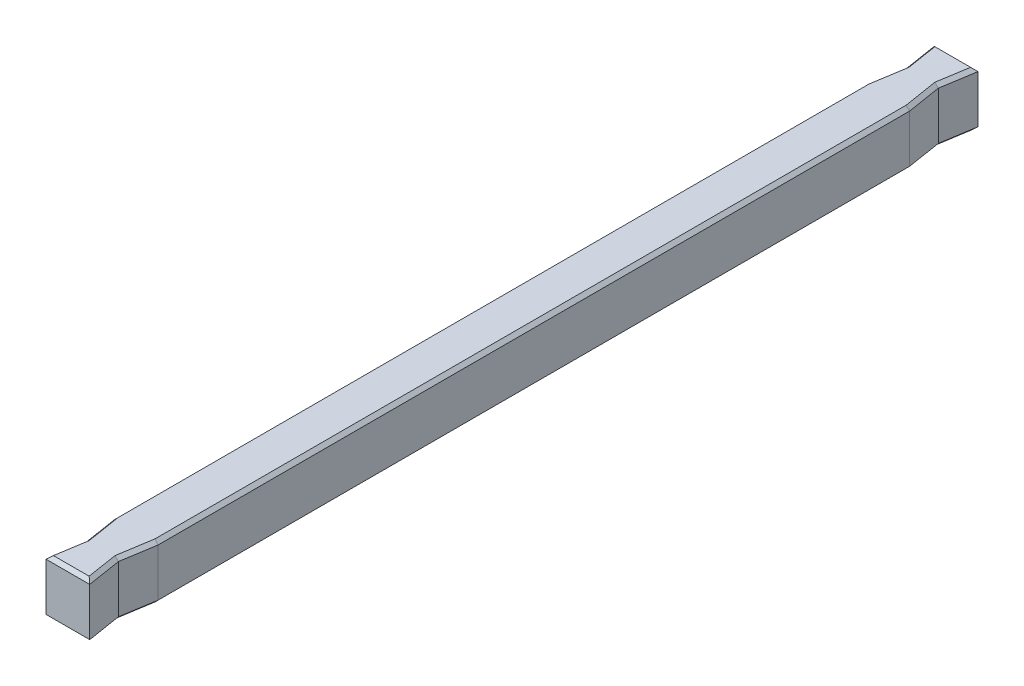
ISO-10303-21;
HEADER;
FILE_DESCRIPTION(('STEP AP214'),'2;1');
FILE_NAME('part.step','',(''),(''),'','','');
FILE_SCHEMA(('AUTOMOTIVE_DESIGN { 1 0 10303 214 1 1 1 1 }'));
ENDSEC;
DATA;
#1=APPLICATION_CONTEXT('core data for automotive mechanical design processes');
#2=APPLICATION_PROTOCOL_DEFINITION('international standard','automotive_design',2000,#1);
#3=PRODUCT_CONTEXT('',#1,'mechanical');
#4=PRODUCT('Part','Part','',(#3));
#5=PRODUCT_RELATED_PRODUCT_CATEGORY('part','',(#4));
#6=PRODUCT_DEFINITION_FORMATION('','',#4);
#7=PRODUCT_DEFINITION_CONTEXT('part definition',#1,'design');
#8=PRODUCT_DEFINITION('design','',#6,#7);
#9=PRODUCT_DEFINITION_SHAPE('','',#8);
#10=(LENGTH_UNIT() NAMED_UNIT(*) SI_UNIT(.MILLI.,.METRE.));
#11=(NAMED_UNIT(*) PLANE_ANGLE_UNIT() SI_UNIT($,.RADIAN.));
#12=(NAMED_UNIT(*) SI_UNIT($,.STERADIAN.) SOLID_ANGLE_UNIT());
#13=UNCERTAINTY_MEASURE_WITH_UNIT(LENGTH_MEASURE(1.E-05),#10,'distance_accuracy_value','');
#14=(GEOMETRIC_REPRESENTATION_CONTEXT(3) GLOBAL_UNCERTAINTY_ASSIGNED_CONTEXT((#13)) GLOBAL_UNIT_ASSIGNED_CONTEXT((#10,
#11,#12)) REPRESENTATION_CONTEXT('',''));
#15=CARTESIAN_POINT('',(0.,0.,0.));
#16=DIRECTION('',(0.,0.,1.));
#17=DIRECTION('',(1.,0.,0.));
#18=AXIS2_PLACEMENT_3D('',#15,#16,#17);
#19=CARTESIAN_POINT('',(-1.6,4.,0.));
#20=DIRECTION('',(0.987440631916705,0.,0.157990501106673));
#21=DIRECTION('',(0.157990501106673,0.,-0.987440631916705));
#22=AXIS2_PLACEMENT_3D('',#19,#20,#21);
#23=PLANE('',#22);
#24=DIRECTION('',(0.,-1.,0.));
#25=VECTOR('',#24,1.);
#26=CARTESIAN_POINT('',(-1.2,4.,-2.5));
#27=LINE('',#26,#25);
#28=CARTESIAN_POINT('',(-1.2,3.74999999999999,-2.5));
#29=VERTEX_POINT('',#28);
#30=CARTESIAN_POINT('',(-1.2,0.249999999999986,-2.5));
#31=VERTEX_POINT('',#30);
#32=EDGE_CURVE('E364',#29,#31,#27,.T.);
#33=ORIENTED_EDGE('',*,*,#32,.T.);
#34=DIRECTION('',(-0.157990501106673,0.,0.987440631916705));
#35=VECTOR('',#34,1.);
#36=CARTESIAN_POINT('',(-1.6,0.249999999999986,0.));
#37=LINE('',#36,#35);
#38=CARTESIAN_POINT('',(-1.6,0.249999999999986,0.));
#39=VERTEX_POINT('',#38);
#40=EDGE_CURVE('E309',#31,#39,#37,.T.);
#41=ORIENTED_EDGE('',*,*,#40,.T.);
#42=DIRECTION('',(0.,-1.,0.));
#43=VECTOR('',#42,1.);
#44=CARTESIAN_POINT('',(-1.6,4.,0.));
#45=LINE('',#44,#43);
#46=CARTESIAN_POINT('',(-1.6,3.74999999999999,0.));
#47=VERTEX_POINT('',#46);
#48=EDGE_CURVE('E224',#47,#39,#45,.T.);
#49=ORIENTED_EDGE('',*,*,#48,.F.);
#50=DIRECTION('',(0.157990501106673,0.,-0.987440631916705));
#51=VECTOR('',#50,1.);
#52=CARTESIAN_POINT('',(-1.6,3.74999999999999,0.));
#53=LINE('',#52,#51);
#54=EDGE_CURVE('E307',#47,#29,#53,.T.);
#55=ORIENTED_EDGE('',*,*,#54,.T.);
#56=EDGE_LOOP('',(#33,#41,#49,#55));
#57=FACE_BOUND('',#56,.T.);
#58=ADVANCED_FACE('F39',(#57),#23,.F.);
#59=CARTESIAN_POINT('',(-1.6,4.,0.));
#60=DIRECTION('',(0.,0.,-1.));
#61=DIRECTION('',(-1.,0.,0.));
#62=AXIS2_PLACEMENT_3D('',#59,#60,#61);
#63=PLANE('',#62);
#64=ORIENTED_EDGE('',*,*,#48,.T.);
#65=DIRECTION('',(1.,0.,0.));
#66=VECTOR('',#65,1.);
#67=CARTESIAN_POINT('',(1.6,0.249999999999986,0.));
#68=LINE('',#67,#66);
#69=CARTESIAN_POINT('',(1.6,0.249999999999986,0.));
#70=VERTEX_POINT('',#69);
#71=EDGE_CURVE('E223',#39,#70,#68,.T.);
#72=ORIENTED_EDGE('',*,*,#71,.T.);
#73=DIRECTION('',(0.,-1.,0.));
#74=VECTOR('',#73,1.);
#75=CARTESIAN_POINT('',(1.6,4.,0.));
#76=LINE('',#75,#74);
#77=CARTESIAN_POINT('',(1.6,3.74999999999999,0.));
#78=VERTEX_POINT('',#77);
#79=EDGE_CURVE('E205',#78,#70,#76,.T.);
#80=ORIENTED_EDGE('',*,*,#79,.F.);
#81=DIRECTION('',(-1.,0.,0.));
#82=VECTOR('',#81,1.);
#83=CARTESIAN_POINT('',(-1.6,3.74999999999999,0.));
#84=LINE('',#83,#82);
#85=EDGE_CURVE('E220',#78,#47,#84,.T.);
#86=ORIENTED_EDGE('',*,*,#85,.T.);
#87=EDGE_LOOP('',(#64,#72,#80,#86));
#88=FACE_BOUND('',#87,.T.);
#89=ADVANCED_FACE('F218',(#88),#63,.F.);
#90=CARTESIAN_POINT('',(1.2,4.,-2.5));
#91=DIRECTION('',(-0.987440631916705,0.,0.157990501106673));
#92=DIRECTION('',(0.157990501106673,0.,0.987440631916705));
#93=AXIS2_PLACEMENT_3D('',#90,#91,#92);
#94=PLANE('',#93);
#95=ORIENTED_EDGE('',*,*,#79,.T.);
#96=DIRECTION('',(-0.157990501106673,0.,-0.987440631916705));
#97=VECTOR('',#96,1.);
#98=CARTESIAN_POINT('',(1.2,0.249999999999986,-2.5));
#99=LINE('',#98,#97);
#100=CARTESIAN_POINT('',(1.2,0.249999999999986,-2.5));
#101=VERTEX_POINT('',#100);
#102=EDGE_CURVE('E212',#70,#101,#99,.T.);
#103=ORIENTED_EDGE('',*,*,#102,.T.);
#104=DIRECTION('',(0.,-1.,0.));
#105=VECTOR('',#104,1.);
#106=CARTESIAN_POINT('',(1.2,4.,-2.5));
#107=LINE('',#106,#105);
#108=CARTESIAN_POINT('',(1.2,3.74999999999999,-2.5));
#109=VERTEX_POINT('',#108);
#110=EDGE_CURVE('E207',#109,#101,#107,.T.);
#111=ORIENTED_EDGE('',*,*,#110,.F.);
#112=DIRECTION('',(0.157990501106673,0.,0.987440631916705));
#113=VECTOR('',#112,1.);
#114=CARTESIAN_POINT('',(1.2,3.74999999999999,-2.5));
#115=LINE('',#114,#113);
#116=EDGE_CURVE('E202',#109,#78,#115,.T.);
#117=ORIENTED_EDGE('',*,*,#116,.T.);
#118=EDGE_LOOP('',(#95,#103,#111,#117));
#119=FACE_BOUND('',#118,.T.);
#120=ADVANCED_FACE('F204',(#119),#94,.F.);
#121=CARTESIAN_POINT('',(1.6,4.,-5.));
#122=DIRECTION('',(-0.987440631916705,0.,-0.157990501106673));
#123=DIRECTION('',(-0.157990501106673,0.,0.987440631916705));
#124=AXIS2_PLACEMENT_3D('',#121,#122,#123);
#125=PLANE('',#124);
#126=ORIENTED_EDGE('',*,*,#110,.T.);
#127=DIRECTION('',(0.157990501106673,0.,-0.987440631916705));
#128=VECTOR('',#127,1.);
#129=CARTESIAN_POINT('',(1.6,0.249999999999986,-5.));
#130=LINE('',#129,#128);
#131=CARTESIAN_POINT('',(1.6,0.249999999999986,-5.));
#132=VERTEX_POINT('',#131);
#133=EDGE_CURVE('E272',#101,#132,#130,.T.);
#134=ORIENTED_EDGE('',*,*,#133,.T.);
#135=DIRECTION('',(0.,-1.,0.));
#136=VECTOR('',#135,1.);
#137=CARTESIAN_POINT('',(1.6,4.,-5.));
#138=LINE('',#137,#136);
#139=CARTESIAN_POINT('',(1.6,3.74999999999999,-5.));
#140=VERTEX_POINT('',#139);
#141=EDGE_CURVE('E414',#140,#132,#138,.T.);
#142=ORIENTED_EDGE('',*,*,#141,.F.);
#143=DIRECTION('',(-0.157990501106673,0.,0.987440631916705));
#144=VECTOR('',#143,1.);
#145=CARTESIAN_POINT('',(1.6,3.74999999999999,-5.));
#146=LINE('',#145,#144);
#147=EDGE_CURVE('E270',#140,#109,#146,.T.);
#148=ORIENTED_EDGE('',*,*,#147,.T.);
#149=EDGE_LOOP('',(#126,#134,#142,#148));
#150=FACE_BOUND('',#149,.T.);
#151=ADVANCED_FACE('F423',(#150),#125,.F.);
#152=CARTESIAN_POINT('',(1.6,4.,-60.));
#153=DIRECTION('',(-1.,0.,0.));
#154=DIRECTION('',(0.,0.,1.));
#155=AXIS2_PLACEMENT_3D('',#152,#153,#154);
#156=PLANE('',#155);
#157=ORIENTED_EDGE('',*,*,#141,.T.);
#158=DIRECTION('',(0.,0.,-1.));
#159=VECTOR('',#158,1.);
#160=CARTESIAN_POINT('',(1.6,0.249999999999986,-60.));
#161=LINE('',#160,#159);
#162=CARTESIAN_POINT('',(1.6,0.249999999999986,-60.));
#163=VERTEX_POINT('',#162);
#164=EDGE_CURVE('E276',#132,#163,#161,.T.);
#165=ORIENTED_EDGE('',*,*,#164,.T.);
#166=DIRECTION('',(0.,-1.,0.));
#167=VECTOR('',#166,1.);
#168=CARTESIAN_POINT('',(1.6,4.,-60.));
#169=LINE('',#168,#167);
#170=CARTESIAN_POINT('',(1.6,3.74999999999999,-60.));
#171=VERTEX_POINT('',#170);
#172=EDGE_CURVE('E405',#171,#163,#169,.T.);
#173=ORIENTED_EDGE('',*,*,#172,.F.);
#174=DIRECTION('',(0.,0.,1.));
#175=VECTOR('',#174,1.);
#176=CARTESIAN_POINT('',(1.6,3.74999999999999,-60.));
#177=LINE('',#176,#175);
#178=EDGE_CURVE('E274',#171,#140,#177,.T.);
#179=ORIENTED_EDGE('',*,*,#178,.T.);
#180=EDGE_LOOP('',(#157,#165,#173,#179));
#181=FACE_BOUND('',#180,.T.);
#182=ADVANCED_FACE('F411',(#181),#156,.F.);
#183=CARTESIAN_POINT('',(1.2,4.,-62.5));
#184=DIRECTION('',(-0.987440631916705,0.,0.157990501106673));
#185=DIRECTION('',(0.157990501106673,0.,0.987440631916705));
#186=AXIS2_PLACEMENT_3D('',#183,#184,#185);
#187=PLANE('',#186);
#188=ORIENTED_EDGE('',*,*,#172,.T.);
#189=DIRECTION('',(-0.157990501106673,0.,-0.987440631916705));
#190=VECTOR('',#189,1.);
#191=CARTESIAN_POINT('',(1.2,0.249999999999986,-62.5));
#192=LINE('',#191,#190);
#193=CARTESIAN_POINT('',(1.2,0.249999999999986,-62.5));
#194=VERTEX_POINT('',#193);
#195=EDGE_CURVE('E280',#163,#194,#192,.T.);
#196=ORIENTED_EDGE('',*,*,#195,.T.);
#197=DIRECTION('',(0.,-1.,0.));
#198=VECTOR('',#197,1.);
#199=CARTESIAN_POINT('',(1.2,4.,-62.5));
#200=LINE('',#199,#198);
#201=CARTESIAN_POINT('',(1.2,3.74999999999999,-62.5));
#202=VERTEX_POINT('',#201);
#203=EDGE_CURVE('E408',#202,#194,#200,.T.);
#204=ORIENTED_EDGE('',*,*,#203,.F.);
#205=DIRECTION('',(0.157990501106673,0.,0.987440631916705));
#206=VECTOR('',#205,1.);
#207=CARTESIAN_POINT('',(1.2,3.74999999999999,-62.5));
#208=LINE('',#207,#206);
#209=EDGE_CURVE('E278',#202,#171,#208,.T.);
#210=ORIENTED_EDGE('',*,*,#209,.T.);
#211=EDGE_LOOP('',(#188,#196,#204,#210));
#212=FACE_BOUND('',#211,.T.);
#213=ADVANCED_FACE('F404',(#212),#187,.F.);
#214=CARTESIAN_POINT('',(1.6,4.,-65.));
#215=DIRECTION('',(-0.987440631916705,0.,-0.157990501106673));
#216=DIRECTION('',(-0.157990501106673,0.,0.987440631916705));
#217=AXIS2_PLACEMENT_3D('',#214,#215,#216);
#218=PLANE('',#217);
#219=ORIENTED_EDGE('',*,*,#203,.T.);
#220=DIRECTION('',(0.157990501106673,0.,-0.987440631916705));
#221=VECTOR('',#220,1.);
#222=CARTESIAN_POINT('',(1.6,0.249999999999986,-65.));
#223=LINE('',#222,#221);
#224=CARTESIAN_POINT('',(1.6,0.249999999999986,-65.));
#225=VERTEX_POINT('',#224);
#226=EDGE_CURVE('E284',#194,#225,#223,.T.);
#227=ORIENTED_EDGE('',*,*,#226,.T.);
#228=DIRECTION('',(0.,-1.,0.));
#229=VECTOR('',#228,1.);
#230=CARTESIAN_POINT('',(1.6,4.,-65.));
#231=LINE('',#230,#229);
#232=CARTESIAN_POINT('',(1.6,3.75,-65.));
#233=VERTEX_POINT('',#232);
#234=EDGE_CURVE('E417',#233,#225,#231,.T.);
#235=ORIENTED_EDGE('',*,*,#234,.F.);
#236=DIRECTION('',(-0.157990501106673,0.,0.987440631916705));
#237=VECTOR('',#236,1.);
#238=CARTESIAN_POINT('',(1.6,3.75,-65.));
#239=LINE('',#238,#237);
#240=EDGE_CURVE('E282',#233,#202,#239,.T.);
#241=ORIENTED_EDGE('',*,*,#240,.T.);
#242=EDGE_LOOP('',(#219,#227,#235,#241));
#243=FACE_BOUND('',#242,.T.);
#244=ADVANCED_FACE('F750',(#243),#218,.F.);
#245=CARTESIAN_POINT('',(-1.59999999999999,4.,-65.));
#246=DIRECTION('',(0.,0.,1.));
#247=DIRECTION('',(1.,0.,0.));
#248=AXIS2_PLACEMENT_3D('',#245,#246,#247);
#249=PLANE('',#248);
#250=ORIENTED_EDGE('',*,*,#234,.T.);
#251=DIRECTION('',(-1.,0.,0.));
#252=VECTOR('',#251,1.);
#253=CARTESIAN_POINT('',(-1.59999999999999,0.249999999999986,-65.));
#254=LINE('',#253,#252);
#255=CARTESIAN_POINT('',(-1.59999999999999,0.249999999999986,-65.));
#256=VERTEX_POINT('',#255);
#257=EDGE_CURVE('E288',#225,#256,#254,.T.);
#258=ORIENTED_EDGE('',*,*,#257,.T.);
#259=DIRECTION('',(0.,-1.,0.));
#260=VECTOR('',#259,1.);
#261=CARTESIAN_POINT('',(-1.59999999999999,4.,-65.));
#262=LINE('',#261,#260);
#263=CARTESIAN_POINT('',(-1.59999999999999,3.74999999999999,-65.));
#264=VERTEX_POINT('',#263);
#265=EDGE_CURVE('E962',#264,#256,#262,.T.);
#266=ORIENTED_EDGE('',*,*,#265,.F.);
#267=DIRECTION('',(1.,0.,0.));
#268=VECTOR('',#267,1.);
#269=CARTESIAN_POINT('',(-1.59999999999999,3.74999999999999,-65.));
#270=LINE('',#269,#268);
#271=EDGE_CURVE('E286',#264,#233,#270,.T.);
#272=ORIENTED_EDGE('',*,*,#271,.T.);
#273=EDGE_LOOP('',(#250,#258,#266,#272));
#274=FACE_BOUND('',#273,.T.);
#275=ADVANCED_FACE('F742',(#274),#249,.F.);
#276=CARTESIAN_POINT('',(-1.2,4.,-62.5));
#277=DIRECTION('',(0.987440631916706,0.,-0.157990501106668));
#278=DIRECTION('',(-0.157990501106668,0.,-0.987440631916706));
#279=AXIS2_PLACEMENT_3D('',#276,#277,#278);
#280=PLANE('',#279);
#281=ORIENTED_EDGE('',*,*,#265,.T.);
#282=DIRECTION('',(0.157990501106668,0.,0.987440631916706));
#283=VECTOR('',#282,1.);
#284=CARTESIAN_POINT('',(-1.2,0.249999999999986,-62.5));
#285=LINE('',#284,#283);
#286=CARTESIAN_POINT('',(-1.2,0.249999999999986,-62.5));
#287=VERTEX_POINT('',#286);
#288=EDGE_CURVE('E292',#256,#287,#285,.T.);
#289=ORIENTED_EDGE('',*,*,#288,.T.);
#290=DIRECTION('',(0.,-1.,0.));
#291=VECTOR('',#290,1.);
#292=CARTESIAN_POINT('',(-1.2,4.,-62.5));
#293=LINE('',#292,#291);
#294=CARTESIAN_POINT('',(-1.2,3.74999999999999,-62.5));
#295=VERTEX_POINT('',#294);
#296=EDGE_CURVE('E964',#295,#287,#293,.T.);
#297=ORIENTED_EDGE('',*,*,#296,.F.);
#298=DIRECTION('',(-0.157990501106668,0.,-0.987440631916706));
#299=VECTOR('',#298,1.);
#300=CARTESIAN_POINT('',(-1.2,3.74999999999999,-62.5));
#301=LINE('',#300,#299);
#302=EDGE_CURVE('E290',#295,#264,#301,.T.);
#303=ORIENTED_EDGE('',*,*,#302,.T.);
#304=EDGE_LOOP('',(#281,#289,#297,#303));
#305=FACE_BOUND('',#304,.T.);
#306=ADVANCED_FACE('F734',(#305),#280,.F.);
#307=CARTESIAN_POINT('',(-1.6,4.,-60.));
#308=DIRECTION('',(0.987440631916705,0.,0.157990501106672));
#309=DIRECTION('',(0.157990501106672,0.,-0.987440631916706));
#310=AXIS2_PLACEMENT_3D('',#307,#308,#309);
#311=PLANE('',#310);
#312=ORIENTED_EDGE('',*,*,#296,.T.);
#313=DIRECTION('',(-0.157990501106672,0.,0.987440631916706));
#314=VECTOR('',#313,1.);
#315=CARTESIAN_POINT('',(-1.6,0.249999999999986,-60.));
#316=LINE('',#315,#314);
#317=CARTESIAN_POINT('',(-1.6,0.249999999999986,-60.));
#318=VERTEX_POINT('',#317);
#319=EDGE_CURVE('E296',#287,#318,#316,.T.);
#320=ORIENTED_EDGE('',*,*,#319,.T.);
#321=DIRECTION('',(0.,-1.,0.));
#322=VECTOR('',#321,1.);
#323=CARTESIAN_POINT('',(-1.6,4.,-60.));
#324=LINE('',#323,#322);
#325=CARTESIAN_POINT('',(-1.6,3.74999999999999,-60.));
#326=VERTEX_POINT('',#325);
#327=EDGE_CURVE('E969',#326,#318,#324,.T.);
#328=ORIENTED_EDGE('',*,*,#327,.F.);
#329=DIRECTION('',(0.157990501106672,0.,-0.987440631916706));
#330=VECTOR('',#329,1.);
#331=CARTESIAN_POINT('',(-1.6,3.74999999999999,-60.));
#332=LINE('',#331,#330);
#333=EDGE_CURVE('E294',#326,#295,#332,.T.);
#334=ORIENTED_EDGE('',*,*,#333,.T.);
#335=EDGE_LOOP('',(#312,#320,#328,#334));
#336=FACE_BOUND('',#335,.T.);
#337=ADVANCED_FACE('F726',(#336),#311,.F.);
#338=CARTESIAN_POINT('',(-1.6,4.,-5.));
#339=DIRECTION('',(1.,0.,0.));
#340=DIRECTION('',(0.,0.,-1.));
#341=AXIS2_PLACEMENT_3D('',#338,#339,#340);
#342=PLANE('',#341);
#343=ORIENTED_EDGE('',*,*,#327,.T.);
#344=DIRECTION('',(0.,0.,1.));
#345=VECTOR('',#344,1.);
#346=CARTESIAN_POINT('',(-1.6,0.249999999999986,-5.));
#347=LINE('',#346,#345);
#348=CARTESIAN_POINT('',(-1.6,0.249999999999986,-5.));
#349=VERTEX_POINT('',#348);
#350=EDGE_CURVE('E300',#318,#349,#347,.T.);
#351=ORIENTED_EDGE('',*,*,#350,.T.);
#352=DIRECTION('',(0.,-1.,0.));
#353=VECTOR('',#352,1.);
#354=CARTESIAN_POINT('',(-1.6,4.,-5.));
#355=LINE('',#354,#353);
#356=CARTESIAN_POINT('',(-1.6,3.74999999999999,-5.));
#357=VERTEX_POINT('',#356);
#358=EDGE_CURVE('E972',#357,#349,#355,.T.);
#359=ORIENTED_EDGE('',*,*,#358,.F.);
#360=DIRECTION('',(0.,0.,-1.));
#361=VECTOR('',#360,1.);
#362=CARTESIAN_POINT('',(-1.6,3.74999999999999,-5.));
#363=LINE('',#362,#361);
#364=EDGE_CURVE('E298',#357,#326,#363,.T.);
#365=ORIENTED_EDGE('',*,*,#364,.T.);
#366=EDGE_LOOP('',(#343,#351,#359,#365));
#367=FACE_BOUND('',#366,.T.);
#368=ADVANCED_FACE('F718',(#367),#342,.F.);
#369=CARTESIAN_POINT('',(-1.2,4.,-2.5));
#370=DIRECTION('',(0.987440631916705,0.,-0.157990501106673));
#371=DIRECTION('',(-0.157990501106673,0.,-0.987440631916705));
#372=AXIS2_PLACEMENT_3D('',#369,#370,#371);
#373=PLANE('',#372);
#374=ORIENTED_EDGE('',*,*,#358,.T.);
#375=DIRECTION('',(0.157990501106673,0.,0.987440631916705));
#376=VECTOR('',#375,1.);
#377=CARTESIAN_POINT('',(-1.2,0.249999999999986,-2.5));
#378=LINE('',#377,#376);
#379=EDGE_CURVE('E305',#349,#31,#378,.T.);
#380=ORIENTED_EDGE('',*,*,#379,.T.);
#381=ORIENTED_EDGE('',*,*,#32,.F.);
#382=DIRECTION('',(-0.157990501106673,0.,-0.987440631916705));
#383=VECTOR('',#382,1.);
#384=CARTESIAN_POINT('',(-1.2,3.74999999999999,-2.5));
#385=LINE('',#384,#383);
#386=EDGE_CURVE('E302',#29,#357,#385,.T.);
#387=ORIENTED_EDGE('',*,*,#386,.T.);
#388=EDGE_LOOP('',(#374,#380,#381,#387));
#389=FACE_BOUND('',#388,.T.);
#390=ADVANCED_FACE('F711',(#389),#373,.F.);
#391=CARTESIAN_POINT('',(0.,4.,0.));
#392=DIRECTION('',(0.,-1.,0.));
#393=DIRECTION('',(0.,0.,-1.));
#394=AXIS2_PLACEMENT_3D('',#391,#392,#393);
#395=PLANE('',#394);
#396=DIRECTION('',(0.,0.,1.));
#397=VECTOR('',#396,1.);
#398=CARTESIAN_POINT('',(-1.34999999999999,4.,0.));
#399=LINE('',#398,#397);
#400=CARTESIAN_POINT('',(-1.34999999999999,4.,-59.9801263873535));
#401=VERTEX_POINT('',#400);
#402=CARTESIAN_POINT('',(-1.34999999999999,4.,-5.01987361264652));
#403=VERTEX_POINT('',#402);
#404=EDGE_CURVE('E49',#401,#403,#399,.T.);
#405=ORIENTED_EDGE('',*,*,#404,.T.);
#406=DIRECTION('',(0.157990501106673,0.,0.987440631916706));
#407=VECTOR('',#406,1.);
#408=CARTESIAN_POINT('',(-0.533171043268863,4.,0.0853073669230181));
#409=LINE('',#408,#407);
#410=CARTESIAN_POINT('',(-0.946820221976546,4.,-2.5));
#411=VERTEX_POINT('',#410);
#412=EDGE_CURVE('E11',#403,#411,#409,.T.);
#413=ORIENTED_EDGE('',*,*,#412,.T.);
#414=DIRECTION('',(-0.157990501106673,0.,0.987440631916706));
#415=VECTOR('',#414,1.);
#416=CARTESIAN_POINT('',(-1.31320224451691,4.,-0.210112359122706));
#417=LINE('',#416,#415);
#418=CARTESIAN_POINT('',(-1.30682022197654,4.,-0.250000000000011));
#419=VERTEX_POINT('',#418);
#420=EDGE_CURVE('E311',#411,#419,#417,.T.);
#421=ORIENTED_EDGE('',*,*,#420,.T.);
#422=DIRECTION('',(1.,0.,0.));
#423=VECTOR('',#422,1.);
#424=CARTESIAN_POINT('',(0.,4.,-0.250000000000011));
#425=LINE('',#424,#423);
#426=CARTESIAN_POINT('',(1.30682022197654,4.,-0.250000000000011));
#427=VERTEX_POINT('',#426);
#428=EDGE_CURVE('E313',#419,#427,#425,.T.);
#429=ORIENTED_EDGE('',*,*,#428,.T.);
#430=DIRECTION('',(-0.157990501106673,0.,-0.987440631916706));
#431=VECTOR('',#430,1.);
#432=CARTESIAN_POINT('',(1.31320224451691,4.,-0.210112359122706));
#433=LINE('',#432,#431);
#434=CARTESIAN_POINT('',(0.946820221976546,4.,-2.5));
#435=VERTEX_POINT('',#434);
#436=EDGE_CURVE('E230',#427,#435,#433,.T.);
#437=ORIENTED_EDGE('',*,*,#436,.T.);
#438=DIRECTION('',(0.157990501106673,0.,-0.987440631916706));
#439=VECTOR('',#438,1.);
#440=CARTESIAN_POINT('',(0.533171043268863,4.,0.0853073669230181));
#441=LINE('',#440,#439);
#442=CARTESIAN_POINT('',(1.34999999999999,4.,-5.01987361264652));
#443=VERTEX_POINT('',#442);
#444=EDGE_CURVE('E316',#435,#443,#441,.T.);
#445=ORIENTED_EDGE('',*,*,#444,.T.);
#446=DIRECTION('',(0.,0.,-1.));
#447=VECTOR('',#446,1.);
#448=CARTESIAN_POINT('',(1.34999999999999,4.,0.));
#449=LINE('',#448,#447);
#450=CARTESIAN_POINT('',(1.34999999999999,4.,-59.9801263873535));
#451=VERTEX_POINT('',#450);
#452=EDGE_CURVE('E318',#443,#451,#449,.T.);
#453=ORIENTED_EDGE('',*,*,#452,.T.);
#454=DIRECTION('',(-0.157990501106673,0.,-0.987440631916706));
#455=VECTOR('',#454,1.);
#456=CARTESIAN_POINT('',(10.6735766594935,4.,-1.70777226551896));
#457=LINE('',#456,#455);
#458=CARTESIAN_POINT('',(0.946820221976545,4.,-62.5));
#459=VERTEX_POINT('',#458);
#460=EDGE_CURVE('E320',#451,#459,#457,.T.);
#461=ORIENTED_EDGE('',*,*,#460,.T.);
#462=DIRECTION('',(0.157990501106673,0.,-0.987440631916706));
#463=VECTOR('',#462,1.);
#464=CARTESIAN_POINT('',(-8.82720337170773,4.,-1.41235253947324));
#465=LINE('',#464,#463);
#466=CARTESIAN_POINT('',(1.30682022197655,4.,-64.75));
#467=VERTEX_POINT('',#466);
#468=EDGE_CURVE('E322',#459,#467,#465,.T.);
#469=ORIENTED_EDGE('',*,*,#468,.T.);
#470=DIRECTION('',(-1.,0.,0.));
#471=VECTOR('',#470,1.);
#472=CARTESIAN_POINT('',(0.,4.,-64.75));
#473=LINE('',#472,#471);
#474=CARTESIAN_POINT('',(-1.30682022197653,4.,-64.75));
#475=VERTEX_POINT('',#474);
#476=EDGE_CURVE('E324',#467,#475,#473,.T.);
#477=ORIENTED_EDGE('',*,*,#476,.T.);
#478=DIRECTION('',(0.157990501106668,0.,0.987440631916706));
#479=VECTOR('',#478,1.);
#480=CARTESIAN_POINT('',(8.82720337170743,4.,-1.41235253947314));
#481=LINE('',#480,#479);
#482=CARTESIAN_POINT('',(-0.946820221976546,4.,-62.5));
#483=VERTEX_POINT('',#482);
#484=EDGE_CURVE('E326',#475,#483,#481,.T.);
#485=ORIENTED_EDGE('',*,*,#484,.T.);
#486=DIRECTION('',(-0.157990501106672,0.,0.987440631916706));
#487=VECTOR('',#486,1.);
#488=CARTESIAN_POINT('',(-10.6735766594935,4.,-1.70777226551895));
#489=LINE('',#488,#487);
#490=EDGE_CURVE('E60',#483,#401,#489,.T.);
#491=ORIENTED_EDGE('',*,*,#490,.T.);
#492=EDGE_LOOP('',(#405,#413,#421,#429,#437,#445,#453,#461,#469,#477,#485,#491));
#493=FACE_BOUND('',#492,.T.);
#494=ADVANCED_FACE('F705',(#493),#395,.F.);
#495=CARTESIAN_POINT('',(0.,0.,0.));
#496=DIRECTION('',(0.,-1.,0.));
#497=DIRECTION('',(0.,0.,-1.));
#498=AXIS2_PLACEMENT_3D('',#495,#496,#497);
#499=PLANE('',#498);
#500=DIRECTION('',(0.157990501106673,0.,0.987440631916706));
#501=VECTOR('',#500,1.);
#502=CARTESIAN_POINT('',(1.35313984202083,0.,0.0394976252766666));
#503=LINE('',#502,#501);
#504=CARTESIAN_POINT('',(0.946820221976567,0.,-2.5));
#505=VERTEX_POINT('',#504);
#506=CARTESIAN_POINT('',(1.30682022197657,0.,-0.24999999999999));
#507=VERTEX_POINT('',#506);
#508=EDGE_CURVE('E265',#505,#507,#503,.T.);
#509=ORIENTED_EDGE('',*,*,#508,.T.);
#510=DIRECTION('',(-1.,0.,0.));
#511=VECTOR('',#510,1.);
#512=CARTESIAN_POINT('',(-1.6,0.,-0.24999999999999));
#513=LINE('',#512,#511);
#514=CARTESIAN_POINT('',(-1.30682022197657,0.,-0.24999999999999));
#515=VERTEX_POINT('',#514);
#516=EDGE_CURVE('E213',#507,#515,#513,.T.);
#517=ORIENTED_EDGE('',*,*,#516,.T.);
#518=DIRECTION('',(0.157990501106673,0.,-0.987440631916706));
#519=VECTOR('',#518,1.);
#520=CARTESIAN_POINT('',(-0.953139842020834,0.,-2.46050237472333));
#521=LINE('',#520,#519);
#522=CARTESIAN_POINT('',(-0.946820221976567,0.,-2.5));
#523=VERTEX_POINT('',#522);
#524=EDGE_CURVE('E242',#515,#523,#521,.T.);
#525=ORIENTED_EDGE('',*,*,#524,.T.);
#526=DIRECTION('',(-0.157990501106673,0.,-0.987440631916706));
#527=VECTOR('',#526,1.);
#528=CARTESIAN_POINT('',(-1.35313984202083,0.,-5.03949762527667));
#529=LINE('',#528,#527);
#530=CARTESIAN_POINT('',(-1.35000000000001,0.,-5.01987361264652));
#531=VERTEX_POINT('',#530);
#532=EDGE_CURVE('E247',#523,#531,#529,.T.);
#533=ORIENTED_EDGE('',*,*,#532,.T.);
#534=DIRECTION('',(0.,0.,-1.));
#535=VECTOR('',#534,1.);
#536=CARTESIAN_POINT('',(-1.35000000000001,0.,-60.));
#537=LINE('',#536,#535);
#538=CARTESIAN_POINT('',(-1.35000000000001,0.,-59.9801263873535));
#539=VERTEX_POINT('',#538);
#540=EDGE_CURVE('E249',#531,#539,#537,.T.);
#541=ORIENTED_EDGE('',*,*,#540,.T.);
#542=DIRECTION('',(0.157990501106672,0.,-0.987440631916706));
#543=VECTOR('',#542,1.);
#544=CARTESIAN_POINT('',(-0.953139842020834,0.,-62.4605023747233));
#545=LINE('',#544,#543);
#546=CARTESIAN_POINT('',(-0.946820221976568,0.,-62.5));
#547=VERTEX_POINT('',#546);
#548=EDGE_CURVE('E251',#539,#547,#545,.T.);
#549=ORIENTED_EDGE('',*,*,#548,.T.);
#550=DIRECTION('',(-0.157990501106668,0.,-0.987440631916706));
#551=VECTOR('',#550,1.);
#552=CARTESIAN_POINT('',(-1.35313984202082,0.,-65.0394976252767));
#553=LINE('',#552,#551);
#554=CARTESIAN_POINT('',(-1.30682022197656,0.,-64.75));
#555=VERTEX_POINT('',#554);
#556=EDGE_CURVE('E253',#547,#555,#553,.T.);
#557=ORIENTED_EDGE('',*,*,#556,.T.);
#558=DIRECTION('',(1.,0.,0.));
#559=VECTOR('',#558,1.);
#560=CARTESIAN_POINT('',(1.6,0.,-64.75));
#561=LINE('',#560,#559);
#562=CARTESIAN_POINT('',(1.30682022197657,0.,-64.75));
#563=VERTEX_POINT('',#562);
#564=EDGE_CURVE('E255',#555,#563,#561,.T.);
#565=ORIENTED_EDGE('',*,*,#564,.T.);
#566=DIRECTION('',(-0.157990501106673,0.,0.987440631916706));
#567=VECTOR('',#566,1.);
#568=CARTESIAN_POINT('',(0.953139842020832,0.,-62.5394976252767));
#569=LINE('',#568,#567);
#570=CARTESIAN_POINT('',(0.946820221976566,0.,-62.5));
#571=VERTEX_POINT('',#570);
#572=EDGE_CURVE('E257',#563,#571,#569,.T.);
#573=ORIENTED_EDGE('',*,*,#572,.T.);
#574=DIRECTION('',(0.157990501106673,0.,0.987440631916706));
#575=VECTOR('',#574,1.);
#576=CARTESIAN_POINT('',(1.35313984202083,0.,-59.9605023747233));
#577=LINE('',#576,#575);
#578=CARTESIAN_POINT('',(1.35000000000001,0.,-59.9801263873535));
#579=VERTEX_POINT('',#578);
#580=EDGE_CURVE('E259',#571,#579,#577,.T.);
#581=ORIENTED_EDGE('',*,*,#580,.T.);
#582=DIRECTION('',(0.,0.,1.));
#583=VECTOR('',#582,1.);
#584=CARTESIAN_POINT('',(1.35000000000001,0.,-5.));
#585=LINE('',#584,#583);
#586=CARTESIAN_POINT('',(1.35000000000001,0.,-5.01987361264652));
#587=VERTEX_POINT('',#586);
#588=EDGE_CURVE('E261',#579,#587,#585,.T.);
#589=ORIENTED_EDGE('',*,*,#588,.T.);
#590=DIRECTION('',(-0.157990501106673,0.,0.987440631916706));
#591=VECTOR('',#590,1.);
#592=CARTESIAN_POINT('',(0.953139842020834,0.,-2.53949762527667));
#593=LINE('',#592,#591);
#594=EDGE_CURVE('E263',#587,#505,#593,.T.);
#595=ORIENTED_EDGE('',*,*,#594,.T.);
#596=EDGE_LOOP('',(#509,#517,#525,#533,#541,#549,#557,#565,#573,#581,#589,#595));
#597=FACE_BOUND('',#596,.T.);
#598=ADVANCED_FACE('F437',(#597),#499,.T.);
#599=CARTESIAN_POINT('',(-1.59999999999999,0.249999999999986,-65.));
#600=DIRECTION('',(0.,-0.707106781186547,-0.707106781186547));
#601=DIRECTION('',(1.,0.,0.));
#602=AXIS2_PLACEMENT_3D('',#599,#600,#601);
#603=PLANE('',#602);
#604=DIRECTION('',(-0.638321886953658,-0.544309272673138,0.544309272673138));
#605=VECTOR('',#604,1.);
#606=CARTESIAN_POINT('',(0.296144539634954,-0.861822470461099,-63.8881775295389));
#607=LINE('',#606,#605);
#608=EDGE_CURVE('E358',#563,#225,#607,.F.);
#609=ORIENTED_EDGE('',*,*,#608,.F.);
#610=ORIENTED_EDGE('',*,*,#564,.F.);
#611=DIRECTION('',(0.638321886953656,-0.544309272673139,0.544309272673139));
#612=VECTOR('',#611,1.);
#613=CARTESIAN_POINT('',(-0.568406762406636,-0.629659269602551,-64.1203407303975));
#614=LINE('',#613,#612);
#615=EDGE_CURVE('E361',#256,#555,#614,.T.);
#616=ORIENTED_EDGE('',*,*,#615,.F.);
#617=ORIENTED_EDGE('',*,*,#257,.F.);
#618=EDGE_LOOP('',(#609,#610,#616,#617));
#619=FACE_BOUND('',#618,.T.);
#620=ADVANCED_FACE('F469',(#619),#603,.T.);
#621=CARTESIAN_POINT('',(-1.2,0.249999999999986,-62.5));
#622=DIRECTION('',(-0.698225966847428,-0.707106781186552,0.111716154695585));
#623=DIRECTION('',(-0.157990501106668,0.,-0.987440631916706));
#624=AXIS2_PLACEMENT_3D('',#621,#622,#623);
#625=PLANE('',#624);
#626=ORIENTED_EDGE('',*,*,#615,.T.);
#627=ORIENTED_EDGE('',*,*,#556,.F.);
#628=DIRECTION('',(0.711561041179083,-0.702624284149174,0.));
#629=VECTOR('',#628,1.);
#630=CARTESIAN_POINT('',(-1.2,0.249999999999986,-62.5));
#631=LINE('',#630,#629);
#632=EDGE_CURVE('E355',#287,#547,#631,.T.);
#633=ORIENTED_EDGE('',*,*,#632,.F.);
#634=ORIENTED_EDGE('',*,*,#288,.F.);
#635=EDGE_LOOP('',(#626,#627,#633,#634));
#636=FACE_BOUND('',#635,.T.);
#637=ADVANCED_FACE('F464',(#636),#625,.T.);
#638=CARTESIAN_POINT('',(1.6,0.249999999999986,-65.));
#639=DIRECTION('',(0.698225966847427,-0.707106781186552,0.111716154695588));
#640=DIRECTION('',(-0.157990501106673,0.,0.987440631916705));
#641=AXIS2_PLACEMENT_3D('',#638,#639,#640);
#642=PLANE('',#641);
#643=ORIENTED_EDGE('',*,*,#608,.T.);
#644=ORIENTED_EDGE('',*,*,#226,.F.);
#645=DIRECTION('',(-0.711561041179084,-0.702624284149174,0.));
#646=VECTOR('',#645,1.);
#647=CARTESIAN_POINT('',(1.2,0.249999999999986,-62.5));
#648=LINE('',#647,#646);
#649=EDGE_CURVE('E352',#571,#194,#648,.F.);
#650=ORIENTED_EDGE('',*,*,#649,.F.);
#651=ORIENTED_EDGE('',*,*,#572,.F.);
#652=EDGE_LOOP('',(#643,#644,#650,#651));
#653=FACE_BOUND('',#652,.T.);
#654=ADVANCED_FACE('F475',(#653),#642,.T.);
#655=CARTESIAN_POINT('',(-1.6,0.249999999999986,-60.));
#656=DIRECTION('',(-0.698225966847427,-0.707106781186552,-0.111716154695588));
#657=DIRECTION('',(0.157990501106672,0.,-0.987440631916706));
#658=AXIS2_PLACEMENT_3D('',#655,#656,#657);
#659=PLANE('',#658);
#660=ORIENTED_EDGE('',*,*,#632,.T.);
#661=ORIENTED_EDGE('',*,*,#548,.F.);
#662=DIRECTION('',(0.705992304603706,-0.705992304603696,0.0561224703724721));
#663=VECTOR('',#662,1.);
#664=CARTESIAN_POINT('',(0.579211770907315,-1.9292117709073,-59.826764757561));
#665=LINE('',#664,#663);
#666=EDGE_CURVE('E349',#318,#539,#665,.T.);
#667=ORIENTED_EDGE('',*,*,#666,.F.);
#668=ORIENTED_EDGE('',*,*,#319,.F.);
#669=EDGE_LOOP('',(#660,#661,#667,#668));
#670=FACE_BOUND('',#669,.T.);
#671=ADVANCED_FACE('F459',(#670),#659,.T.);
#672=CARTESIAN_POINT('',(1.2,0.249999999999986,-62.5));
#673=DIRECTION('',(0.698225966847427,-0.707106781186552,-0.111716154695588));
#674=DIRECTION('',(0.157990501106673,0.,0.987440631916705));
#675=AXIS2_PLACEMENT_3D('',#672,#673,#674);
#676=PLANE('',#675);
#677=ORIENTED_EDGE('',*,*,#649,.T.);
#678=ORIENTED_EDGE('',*,*,#195,.F.);
#679=DIRECTION('',(-0.705992304603706,-0.705992304603697,0.0561224703724764));
#680=VECTOR('',#679,1.);
#681=CARTESIAN_POINT('',(1.49968502683193,0.149685026831921,-59.9920255163224));
#682=LINE('',#681,#680);
#683=EDGE_CURVE('E346',#579,#163,#682,.F.);
#684=ORIENTED_EDGE('',*,*,#683,.F.);
#685=ORIENTED_EDGE('',*,*,#580,.F.);
#686=EDGE_LOOP('',(#677,#678,#684,#685));
#687=FACE_BOUND('',#686,.T.);
#688=ADVANCED_FACE('F480',(#687),#676,.T.);
#689=CARTESIAN_POINT('',(-1.6,0.249999999999986,-5.));
#690=DIRECTION('',(-0.707106781186543,-0.707106781186552,0.));
#691=DIRECTION('',(0.,0.,-1.));
#692=AXIS2_PLACEMENT_3D('',#689,#690,#691);
#693=PLANE('',#692);
#694=ORIENTED_EDGE('',*,*,#666,.T.);
#695=ORIENTED_EDGE('',*,*,#540,.F.);
#696=DIRECTION('',(0.705992304603706,-0.705992304603697,-0.0561224703724689));
#697=VECTOR('',#696,1.);
#698=CARTESIAN_POINT('',(-1.49968502683192,0.149685026831908,-5.00797448367755));
#699=LINE('',#698,#697);
#700=EDGE_CURVE('E343',#349,#531,#699,.T.);
#701=ORIENTED_EDGE('',*,*,#700,.F.);
#702=ORIENTED_EDGE('',*,*,#350,.F.);
#703=EDGE_LOOP('',(#694,#695,#701,#702));
#704=FACE_BOUND('',#703,.T.);
#705=ADVANCED_FACE('F454',(#704),#693,.T.);
#706=CARTESIAN_POINT('',(1.6,0.249999999999986,-60.));
#707=DIRECTION('',(0.707106781186543,-0.707106781186552,0.));
#708=DIRECTION('',(0.,0.,1.));
#709=AXIS2_PLACEMENT_3D('',#706,#707,#708);
#710=PLANE('',#709);
#711=ORIENTED_EDGE('',*,*,#683,.T.);
#712=ORIENTED_EDGE('',*,*,#164,.F.);
#713=DIRECTION('',(-0.705992304603706,-0.705992304603697,-0.0561224703724719));
#714=VECTOR('',#713,1.);
#715=CARTESIAN_POINT('',(-0.579211770907306,-1.92921177090729,-5.173235242439));
#716=LINE('',#715,#714);
#717=EDGE_CURVE('E340',#587,#132,#716,.F.);
#718=ORIENTED_EDGE('',*,*,#717,.F.);
#719=ORIENTED_EDGE('',*,*,#588,.F.);
#720=EDGE_LOOP('',(#711,#712,#718,#719));
#721=FACE_BOUND('',#720,.T.);
#722=ADVANCED_FACE('F482',(#721),#710,.T.);
#723=CARTESIAN_POINT('',(-1.2,0.249999999999986,-2.5));
#724=DIRECTION('',(-0.698225966847428,-0.707106781186552,0.111716154695588));
#725=DIRECTION('',(-0.157990501106673,0.,-0.987440631916705));
#726=AXIS2_PLACEMENT_3D('',#723,#724,#725);
#727=PLANE('',#726);
#728=ORIENTED_EDGE('',*,*,#700,.T.);
#729=ORIENTED_EDGE('',*,*,#532,.F.);
#730=DIRECTION('',(0.711561041179083,-0.702624284149174,0.));
#731=VECTOR('',#730,1.);
#732=CARTESIAN_POINT('',(-1.2,0.249999999999986,-2.5));
#733=LINE('',#732,#731);
#734=EDGE_CURVE('E337',#31,#523,#733,.T.);
#735=ORIENTED_EDGE('',*,*,#734,.F.);
#736=ORIENTED_EDGE('',*,*,#379,.F.);
#737=EDGE_LOOP('',(#728,#729,#735,#736));
#738=FACE_BOUND('',#737,.T.);
#739=ADVANCED_FACE('F449',(#738),#727,.T.);
#740=CARTESIAN_POINT('',(1.6,0.249999999999986,-5.));
#741=DIRECTION('',(0.698225966847427,-0.707106781186552,0.111716154695588));
#742=DIRECTION('',(-0.157990501106673,0.,0.987440631916705));
#743=AXIS2_PLACEMENT_3D('',#740,#741,#742);
#744=PLANE('',#743);
#745=ORIENTED_EDGE('',*,*,#717,.T.);
#746=ORIENTED_EDGE('',*,*,#133,.F.);
#747=DIRECTION('',(-0.711561041179083,-0.702624284149174,0.));
#748=VECTOR('',#747,1.);
#749=CARTESIAN_POINT('',(1.2,0.249999999999986,-2.5));
#750=LINE('',#749,#748);
#751=EDGE_CURVE('E334',#505,#101,#750,.F.);
#752=ORIENTED_EDGE('',*,*,#751,.F.);
#753=ORIENTED_EDGE('',*,*,#594,.F.);
#754=EDGE_LOOP('',(#745,#746,#752,#753));
#755=FACE_BOUND('',#754,.T.);
#756=ADVANCED_FACE('F427',(#755),#744,.T.);
#757=CARTESIAN_POINT('',(-1.6,0.249999999999986,0.));
#758=DIRECTION('',(-0.698225966847428,-0.707106781186552,-0.111716154695588));
#759=DIRECTION('',(0.157990501106673,0.,-0.987440631916705));
#760=AXIS2_PLACEMENT_3D('',#757,#758,#759);
#761=PLANE('',#760);
#762=ORIENTED_EDGE('',*,*,#734,.T.);
#763=ORIENTED_EDGE('',*,*,#524,.F.);
#764=DIRECTION('',(-0.638321886953656,0.544309272673136,0.544309272673143));
#765=VECTOR('',#764,1.);
#766=CARTESIAN_POINT('',(-1.6,0.249999999999986,0.));
#767=LINE('',#766,#765);
#768=EDGE_CURVE('E332',#39,#515,#767,.F.);
#769=ORIENTED_EDGE('',*,*,#768,.F.);
#770=ORIENTED_EDGE('',*,*,#40,.F.);
#771=EDGE_LOOP('',(#762,#763,#769,#770));
#772=FACE_BOUND('',#771,.T.);
#773=ADVANCED_FACE('F444',(#772),#761,.T.);
#774=CARTESIAN_POINT('',(1.2,0.249999999999986,-2.5));
#775=DIRECTION('',(0.698225966847428,-0.707106781186552,-0.111716154695588));
#776=DIRECTION('',(0.157990501106673,0.,0.987440631916705));
#777=AXIS2_PLACEMENT_3D('',#774,#775,#776);
#778=PLANE('',#777);
#779=ORIENTED_EDGE('',*,*,#751,.T.);
#780=ORIENTED_EDGE('',*,*,#102,.F.);
#781=DIRECTION('',(-0.638321886953656,-0.544309272673136,-0.544309272673143));
#782=VECTOR('',#781,1.);
#783=CARTESIAN_POINT('',(0.568406762406638,-0.629659269602554,-0.879659269602552));
#784=LINE('',#783,#782);
#785=EDGE_CURVE('E330',#507,#70,#784,.F.);
#786=ORIENTED_EDGE('',*,*,#785,.F.);
#787=ORIENTED_EDGE('',*,*,#508,.F.);
#788=EDGE_LOOP('',(#779,#780,#786,#787));
#789=FACE_BOUND('',#788,.T.);
#790=ADVANCED_FACE('F433',(#789),#778,.T.);
#791=CARTESIAN_POINT('',(-1.6,0.249999999999986,0.));
#792=DIRECTION('',(0.,-0.707106781186552,0.707106781186543));
#793=DIRECTION('',(-1.,0.,0.));
#794=AXIS2_PLACEMENT_3D('',#791,#792,#793);
#795=PLANE('',#794);
#796=ORIENTED_EDGE('',*,*,#768,.T.);
#797=ORIENTED_EDGE('',*,*,#516,.F.);
#798=ORIENTED_EDGE('',*,*,#785,.T.);
#799=ORIENTED_EDGE('',*,*,#71,.F.);
#800=EDGE_LOOP('',(#796,#797,#798,#799));
#801=FACE_BOUND('',#800,.T.);
#802=ADVANCED_FACE('F439',(#801),#795,.T.);
#803=CARTESIAN_POINT('',(10.6735766594935,4.,-1.70777226551896));
#804=DIRECTION('',(-0.698225966847425,-0.707106781186555,0.111716154695588));
#805=DIRECTION('',(-0.157990501106673,0.,-0.987440631916705));
#806=AXIS2_PLACEMENT_3D('',#803,#804,#805);
#807=PLANE('',#806);
#808=DIRECTION('',(-0.705992304603705,0.705992304603695,0.0561224703725028));
#809=VECTOR('',#808,1.);
#810=CARTESIAN_POINT('',(-1.02653449898002,6.37653449897997,-59.7912050830581));
#811=LINE('',#810,#809);
#812=EDGE_CURVE('E384',#171,#451,#811,.T.);
#813=ORIENTED_EDGE('',*,*,#812,.F.);
#814=ORIENTED_EDGE('',*,*,#209,.F.);
#815=DIRECTION('',(-0.711561041179084,0.702624284149174,0.));
#816=VECTOR('',#815,1.);
#817=CARTESIAN_POINT('',(-4.00195475713356,8.886621492586,-62.4999999999998));
#818=LINE('',#817,#816);
#819=EDGE_CURVE('E44',#459,#202,#818,.F.);
#820=ORIENTED_EDGE('',*,*,#819,.F.);
#821=ORIENTED_EDGE('',*,*,#460,.F.);
#822=EDGE_LOOP('',(#813,#814,#820,#821));
#823=FACE_BOUND('',#822,.T.);
#824=ADVANCED_FACE('F42',(#823),#807,.F.);
#825=CARTESIAN_POINT('',(-8.82720337170772,4.,-1.41235253947323));
#826=DIRECTION('',(-0.69822596684743,-0.70710678118655,-0.111716154695589));
#827=DIRECTION('',(0.157990501106673,0.,-0.987440631916705));
#828=AXIS2_PLACEMENT_3D('',#825,#826,#827);
#829=PLANE('',#828);
#830=ORIENTED_EDGE('',*,*,#819,.T.);
#831=ORIENTED_EDGE('',*,*,#240,.F.);
#832=DIRECTION('',(-0.638321886953652,0.544309272673134,0.544309272673149));
#833=VECTOR('',#832,1.);
#834=CARTESIAN_POINT('',(-24.8286553001642,26.2862194813882,-42.4637805186112));
#835=LINE('',#834,#833);
#836=EDGE_CURVE('E382',#467,#233,#835,.F.);
#837=ORIENTED_EDGE('',*,*,#836,.F.);
#838=ORIENTED_EDGE('',*,*,#468,.F.);
#839=EDGE_LOOP('',(#830,#831,#837,#838));
#840=FACE_BOUND('',#839,.T.);
#841=ADVANCED_FACE('F395',(#840),#829,.F.);
#842=CARTESIAN_POINT('',(1.34999999999999,4.,0.));
#843=DIRECTION('',(-0.707106781186543,-0.707106781186553,0.));
#844=DIRECTION('',(0.,0.,-1.));
#845=AXIS2_PLACEMENT_3D('',#842,#843,#844);
#846=PLANE('',#845);
#847=ORIENTED_EDGE('',*,*,#812,.T.);
#848=ORIENTED_EDGE('',*,*,#452,.F.);
#849=DIRECTION('',(-0.705992304603706,0.705992304603696,-0.0561224703724699));
#850=VECTOR('',#849,1.);
#851=CARTESIAN_POINT('',(1.14514956280651,4.20485043719348,-5.03615808560353));
#852=LINE('',#851,#850);
#853=EDGE_CURVE('E379',#140,#443,#852,.T.);
#854=ORIENTED_EDGE('',*,*,#853,.F.);
#855=ORIENTED_EDGE('',*,*,#178,.F.);
#856=EDGE_LOOP('',(#847,#848,#854,#855));
#857=FACE_BOUND('',#856,.T.);
#858=ADVANCED_FACE('F610',(#857),#846,.F.);
#859=CARTESIAN_POINT('',(0.,4.,-64.75));
#860=DIRECTION('',(0.,-0.707106781186557,0.707106781186538));
#861=DIRECTION('',(-1.,0.,0.));
#862=AXIS2_PLACEMENT_3D('',#859,#860,#861);
#863=PLANE('',#862);
#864=ORIENTED_EDGE('',*,*,#836,.T.);
#865=ORIENTED_EDGE('',*,*,#271,.F.);
#866=DIRECTION('',(0.638321886953652,0.544309272673134,0.544309272673149));
#867=VECTOR('',#866,1.);
#868=CARTESIAN_POINT('',(-0.774350008807928,4.45404752738951,-64.2959524726105));
#869=LINE('',#868,#867);
#870=EDGE_CURVE('E376',#475,#264,#869,.F.);
#871=ORIENTED_EDGE('',*,*,#870,.F.);
#872=ORIENTED_EDGE('',*,*,#476,.F.);
#873=EDGE_LOOP('',(#864,#865,#871,#872));
#874=FACE_BOUND('',#873,.T.);
#875=ADVANCED_FACE('F603',(#874),#863,.F.);
#876=CARTESIAN_POINT('',(0.533171043268863,4.,0.0853073669230181));
#877=DIRECTION('',(-0.698225966847427,-0.707106781186552,-0.111716154695588));
#878=DIRECTION('',(0.157990501106673,0.,-0.987440631916705));
#879=AXIS2_PLACEMENT_3D('',#876,#877,#878);
#880=PLANE('',#879);
#881=ORIENTED_EDGE('',*,*,#853,.T.);
#882=ORIENTED_EDGE('',*,*,#444,.F.);
#883=DIRECTION('',(-0.711561041179083,0.702624284149174,0.));
#884=VECTOR('',#883,1.);
#885=CARTESIAN_POINT('',(0.737381735758832,4.20680807117849,-2.5));
#886=LINE('',#885,#884);
#887=EDGE_CURVE('E374',#109,#435,#886,.T.);
#888=ORIENTED_EDGE('',*,*,#887,.F.);
#889=ORIENTED_EDGE('',*,*,#147,.F.);
#890=EDGE_LOOP('',(#881,#882,#888,#889));
#891=FACE_BOUND('',#890,.T.);
#892=ADVANCED_FACE('F596',(#891),#880,.F.);
#893=CARTESIAN_POINT('',(8.82720337170743,4.,-1.41235253947314));
#894=DIRECTION('',(0.698225966847428,-0.707106781186552,-0.111716154695585));
#895=DIRECTION('',(0.157990501106668,0.,0.987440631916706));
#896=AXIS2_PLACEMENT_3D('',#893,#894,#895);
#897=PLANE('',#896);
#898=ORIENTED_EDGE('',*,*,#870,.T.);
#899=ORIENTED_EDGE('',*,*,#302,.F.);
#900=DIRECTION('',(0.711561041179082,0.702624284149175,0.));
#901=VECTOR('',#900,1.);
#902=CARTESIAN_POINT('',(-5.87166293639135,-0.862989802012088,-62.4999999999999));
#903=LINE('',#902,#901);
#904=EDGE_CURVE('E233',#483,#295,#903,.F.);
#905=ORIENTED_EDGE('',*,*,#904,.F.);
#906=ORIENTED_EDGE('',*,*,#484,.F.);
#907=EDGE_LOOP('',(#898,#899,#905,#906));
#908=FACE_BOUND('',#907,.T.);
#909=ADVANCED_FACE('F590',(#908),#897,.F.);
#910=CARTESIAN_POINT('',(1.31320224451691,4.,-0.210112359122706));
#911=DIRECTION('',(-0.698225966847427,-0.707106781186552,0.111716154695588));
#912=DIRECTION('',(-0.157990501106673,0.,-0.987440631916705));
#913=AXIS2_PLACEMENT_3D('',#910,#911,#912);
#914=PLANE('',#913);
#915=ORIENTED_EDGE('',*,*,#887,.T.);
#916=ORIENTED_EDGE('',*,*,#436,.F.);
#917=DIRECTION('',(-0.638321886953656,0.544309272673136,-0.544309272673143));
#918=VECTOR('',#917,1.);
#919=CARTESIAN_POINT('',(0.774350008807928,4.45404752738952,-0.704047527389536));
#920=LINE('',#919,#918);
#921=EDGE_CURVE('E228',#78,#427,#920,.T.);
#922=ORIENTED_EDGE('',*,*,#921,.F.);
#923=ORIENTED_EDGE('',*,*,#116,.F.);
#924=EDGE_LOOP('',(#915,#916,#922,#923));
#925=FACE_BOUND('',#924,.T.);
#926=ADVANCED_FACE('F229',(#925),#914,.F.);
#927=CARTESIAN_POINT('',(-10.6735766594935,4.,-1.70777226551895));
#928=DIRECTION('',(0.69822596684743,-0.70710678118655,0.111716154695588));
#929=DIRECTION('',(-0.157990501106672,0.,0.987440631916706));
#930=AXIS2_PLACEMENT_3D('',#927,#928,#929);
#931=PLANE('',#930);
#932=ORIENTED_EDGE('',*,*,#904,.T.);
#933=ORIENTED_EDGE('',*,*,#333,.F.);
#934=DIRECTION('',(0.705992304603708,0.705992304603698,0.0561224703724422));
#935=VECTOR('',#934,1.);
#936=CARTESIAN_POINT('',(-3.68823585607015,1.66176414392988,-60.1660031620723));
#937=LINE('',#936,#935);
#938=EDGE_CURVE('E234',#401,#326,#937,.F.);
#939=ORIENTED_EDGE('',*,*,#938,.F.);
#940=ORIENTED_EDGE('',*,*,#490,.F.);
#941=EDGE_LOOP('',(#932,#933,#939,#940));
#942=FACE_BOUND('',#941,.T.);
#943=ADVANCED_FACE('F578',(#942),#931,.F.);
#944=CARTESIAN_POINT('',(0.,4.,-0.250000000000011));
#945=DIRECTION('',(0.,-0.707106781186552,-0.707106781186543));
#946=DIRECTION('',(1.,0.,0.));
#947=AXIS2_PLACEMENT_3D('',#944,#945,#946);
#948=PLANE('',#947);
#949=ORIENTED_EDGE('',*,*,#921,.T.);
#950=ORIENTED_EDGE('',*,*,#428,.F.);
#951=DIRECTION('',(0.638321886953656,0.544309272673136,-0.544309272673143));
#952=VECTOR('',#951,1.);
#953=CARTESIAN_POINT('',(-1.32327935021358,3.98596498678388,-0.235964986783891));
#954=LINE('',#953,#952);
#955=EDGE_CURVE('E239',#47,#419,#954,.T.);
#956=ORIENTED_EDGE('',*,*,#955,.F.);
#957=ORIENTED_EDGE('',*,*,#85,.F.);
#958=EDGE_LOOP('',(#949,#950,#956,#957));
#959=FACE_BOUND('',#958,.T.);
#960=ADVANCED_FACE('F237',(#959),#948,.F.);
#961=CARTESIAN_POINT('',(-1.34999999999999,4.,0.));
#962=DIRECTION('',(0.707106781186543,-0.707106781186552,0.));
#963=DIRECTION('',(0.,0.,1.));
#964=AXIS2_PLACEMENT_3D('',#961,#962,#963);
#965=PLANE('',#964);
#966=ORIENTED_EDGE('',*,*,#938,.T.);
#967=ORIENTED_EDGE('',*,*,#364,.F.);
#968=DIRECTION('',(0.705992304603706,0.705992304603697,-0.0561224703724714));
#969=VECTOR('',#968,1.);
#970=CARTESIAN_POINT('',(-1.54889759391174,3.80110240608825,-5.00406235769561));
#971=LINE('',#970,#969);
#972=EDGE_CURVE('E367',#403,#357,#971,.F.);
#973=ORIENTED_EDGE('',*,*,#972,.F.);
#974=ORIENTED_EDGE('',*,*,#404,.F.);
#975=EDGE_LOOP('',(#966,#967,#973,#974));
#976=FACE_BOUND('',#975,.T.);
#977=ADVANCED_FACE('F565',(#976),#965,.F.);
#978=CARTESIAN_POINT('',(-1.31320224451691,4.,-0.210112359122706));
#979=DIRECTION('',(0.698225966847427,-0.707106781186552,0.111716154695588));
#980=DIRECTION('',(-0.157990501106673,0.,0.987440631916705));
#981=AXIS2_PLACEMENT_3D('',#978,#979,#980);
#982=PLANE('',#981);
#983=ORIENTED_EDGE('',*,*,#955,.T.);
#984=ORIENTED_EDGE('',*,*,#420,.F.);
#985=DIRECTION('',(-0.711561041179083,-0.702624284149174,0.));
#986=VECTOR('',#985,1.);
#987=CARTESIAN_POINT('',(-0.737381735758832,4.20680807117849,-2.5));
#988=LINE('',#987,#986);
#989=EDGE_CURVE('E365',#29,#411,#988,.F.);
#990=ORIENTED_EDGE('',*,*,#989,.F.);
#991=ORIENTED_EDGE('',*,*,#54,.F.);
#992=EDGE_LOOP('',(#983,#984,#990,#991));
#993=FACE_BOUND('',#992,.T.);
#994=ADVANCED_FACE('F558',(#993),#982,.F.);
#995=CARTESIAN_POINT('',(-0.533171043268863,4.,0.0853073669230181));
#996=DIRECTION('',(0.698225966847427,-0.707106781186552,-0.111716154695588));
#997=DIRECTION('',(0.157990501106673,0.,0.987440631916705));
#998=AXIS2_PLACEMENT_3D('',#995,#996,#997);
#999=PLANE('',#998);
#1000=ORIENTED_EDGE('',*,*,#972,.T.);
#1001=ORIENTED_EDGE('',*,*,#386,.F.);
#1002=ORIENTED_EDGE('',*,*,#989,.T.);
#1003=ORIENTED_EDGE('',*,*,#412,.F.);
#1004=EDGE_LOOP('',(#1000,#1001,#1002,#1003));
#1005=FACE_BOUND('',#1004,.T.);
#1006=ADVANCED_FACE('F552',(#1005),#999,.F.);
#1007=CLOSED_SHELL('',(#58,#89,#120,#151,#182,#213,#244,#275,#306,#337,#368,#390,#494,#598,#620,
#637,#654,#671,#688,#705,#722,#739,#756,#773,#790,#802,#824,#841,#858,#875,#892,#909,#926,#943,
#960,#977,#994,#1006));
#1008=MANIFOLD_SOLID_BREP('B2',#1007);
#1009=ADVANCED_BREP_SHAPE_REPRESENTATION('',(#18,#1008),#14);
#1010=SHAPE_DEFINITION_REPRESENTATION(#9,#1009);
ENDSEC;
END-ISO-10303-21;
